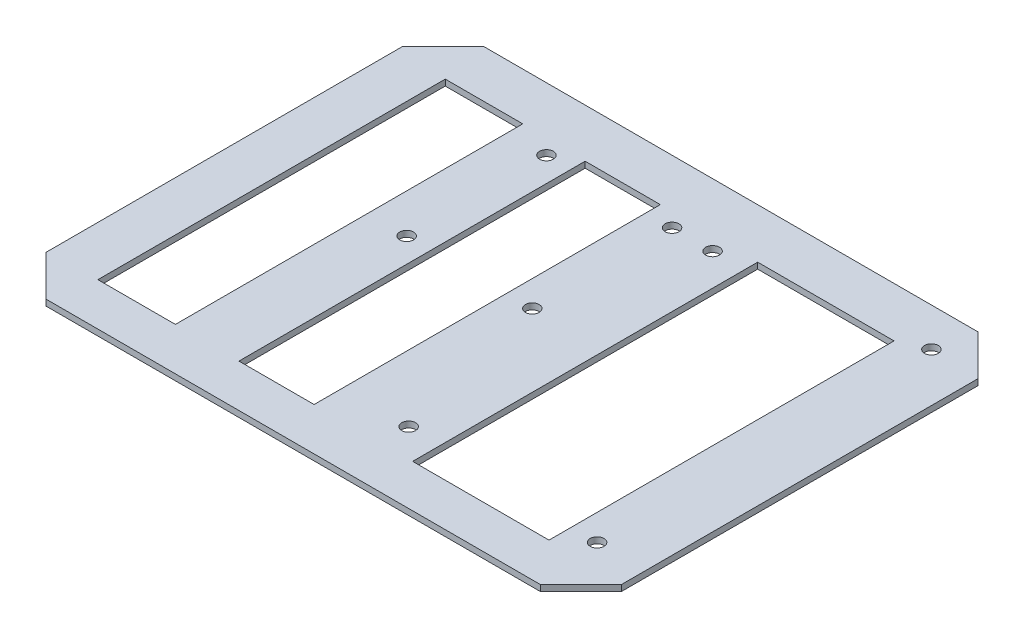
ISO-10303-21;
HEADER;
FILE_DESCRIPTION(('STEP AP214'),'2;1');
FILE_NAME('part.step','',(''),(''),'','','');
FILE_SCHEMA(('AUTOMOTIVE_DESIGN { 1 0 10303 214 1 1 1 1 }'));
ENDSEC;
DATA;
#1=APPLICATION_CONTEXT('core data for automotive mechanical design processes');
#2=APPLICATION_PROTOCOL_DEFINITION('international standard','automotive_design',2000,#1);
#3=PRODUCT_CONTEXT('',#1,'mechanical');
#4=PRODUCT('Part','Part','',(#3));
#5=PRODUCT_RELATED_PRODUCT_CATEGORY('part','',(#4));
#6=PRODUCT_DEFINITION_FORMATION('','',#4);
#7=PRODUCT_DEFINITION_CONTEXT('part definition',#1,'design');
#8=PRODUCT_DEFINITION('design','',#6,#7);
#9=PRODUCT_DEFINITION_SHAPE('','',#8);
#10=(LENGTH_UNIT() NAMED_UNIT(*) SI_UNIT(.MILLI.,.METRE.));
#11=(NAMED_UNIT(*) PLANE_ANGLE_UNIT() SI_UNIT($,.RADIAN.));
#12=(NAMED_UNIT(*) SI_UNIT($,.STERADIAN.) SOLID_ANGLE_UNIT());
#13=UNCERTAINTY_MEASURE_WITH_UNIT(LENGTH_MEASURE(1.E-05),#10,'distance_accuracy_value','');
#14=(GEOMETRIC_REPRESENTATION_CONTEXT(3) GLOBAL_UNCERTAINTY_ASSIGNED_CONTEXT((#13)) GLOBAL_UNIT_ASSIGNED_CONTEXT((#10,
#11,#12)) REPRESENTATION_CONTEXT('',''));
#15=CARTESIAN_POINT('',(0.,0.,0.));
#16=DIRECTION('',(0.,0.,1.));
#17=DIRECTION('',(1.,0.,0.));
#18=AXIS2_PLACEMENT_3D('',#15,#16,#17);
#19=CARTESIAN_POINT('',(71.,1.5,54.));
#20=DIRECTION('',(-1.,0.,0.));
#21=DIRECTION('',(0.,0.,1.));
#22=AXIS2_PLACEMENT_3D('',#19,#20,#21);
#23=PLANE('',#22);
#24=DIRECTION('',(0.,0.,-1.));
#25=VECTOR('',#24,1.);
#26=CARTESIAN_POINT('',(71.,0.,54.));
#27=LINE('',#26,#25);
#28=CARTESIAN_POINT('',(71.,0.,44.));
#29=VERTEX_POINT('',#28);
#30=CARTESIAN_POINT('',(71.,0.,-44.));
#31=VERTEX_POINT('',#30);
#32=EDGE_CURVE('E316',#29,#31,#27,.T.);
#33=ORIENTED_EDGE('',*,*,#32,.T.);
#34=DIRECTION('',(0.,1.,0.));
#35=VECTOR('',#34,1.);
#36=CARTESIAN_POINT('',(71.,1.5,-44.));
#37=LINE('',#36,#35);
#38=CARTESIAN_POINT('',(71.,1.5,-43.9999999999999));
#39=VERTEX_POINT('',#38);
#40=EDGE_CURVE('E358',#31,#39,#37,.T.);
#41=ORIENTED_EDGE('',*,*,#40,.T.);
#42=DIRECTION('',(0.,0.,-1.));
#43=VECTOR('',#42,1.);
#44=CARTESIAN_POINT('',(71.,1.5,54.));
#45=LINE('',#44,#43);
#46=CARTESIAN_POINT('',(71.,1.5,44.));
#47=VERTEX_POINT('',#46);
#48=EDGE_CURVE('E319',#47,#39,#45,.T.);
#49=ORIENTED_EDGE('',*,*,#48,.F.);
#50=DIRECTION('',(0.,-1.,0.));
#51=VECTOR('',#50,1.);
#52=CARTESIAN_POINT('',(71.,1.5,44.));
#53=LINE('',#52,#51);
#54=EDGE_CURVE('E355',#47,#29,#53,.T.);
#55=ORIENTED_EDGE('',*,*,#54,.T.);
#56=EDGE_LOOP('',(#33,#41,#49,#55));
#57=FACE_BOUND('',#56,.T.);
#58=ADVANCED_FACE('F35',(#57),#23,.F.);
#59=CARTESIAN_POINT('',(-71.,1.5,-54.));
#60=DIRECTION('',(0.,0.,1.));
#61=DIRECTION('',(1.,0.,0.));
#62=AXIS2_PLACEMENT_3D('',#59,#60,#61);
#63=PLANE('',#62);
#64=DIRECTION('',(-1.,0.,0.));
#65=VECTOR('',#64,1.);
#66=CARTESIAN_POINT('',(-71.,1.5,-54.));
#67=LINE('',#66,#65);
#68=CARTESIAN_POINT('',(61.,1.5,-54.));
#69=VERTEX_POINT('',#68);
#70=CARTESIAN_POINT('',(-61.,1.5,-54.));
#71=VERTEX_POINT('',#70);
#72=EDGE_CURVE('E322',#69,#71,#67,.T.);
#73=ORIENTED_EDGE('',*,*,#72,.F.);
#74=DIRECTION('',(0.,-1.,0.));
#75=VECTOR('',#74,1.);
#76=CARTESIAN_POINT('',(61.,1.5,-54.));
#77=LINE('',#76,#75);
#78=CARTESIAN_POINT('',(61.,0.,-54.));
#79=VERTEX_POINT('',#78);
#80=EDGE_CURVE('E344',#69,#79,#77,.T.);
#81=ORIENTED_EDGE('',*,*,#80,.T.);
#82=DIRECTION('',(-1.,0.,0.));
#83=VECTOR('',#82,1.);
#84=CARTESIAN_POINT('',(-71.,0.,-54.));
#85=LINE('',#84,#83);
#86=CARTESIAN_POINT('',(-61.,0.,-54.));
#87=VERTEX_POINT('',#86);
#88=EDGE_CURVE('E335',#79,#87,#85,.T.);
#89=ORIENTED_EDGE('',*,*,#88,.T.);
#90=DIRECTION('',(0.,1.,0.));
#91=VECTOR('',#90,1.);
#92=CARTESIAN_POINT('',(-61.,1.5,-54.));
#93=LINE('',#92,#91);
#94=EDGE_CURVE('E332',#87,#71,#93,.T.);
#95=ORIENTED_EDGE('',*,*,#94,.T.);
#96=EDGE_LOOP('',(#73,#81,#89,#95));
#97=FACE_BOUND('',#96,.T.);
#98=ADVANCED_FACE('F396',(#97),#63,.F.);
#99=CARTESIAN_POINT('',(-71.,1.5,54.));
#100=DIRECTION('',(1.,0.,0.));
#101=DIRECTION('',(0.,0.,-1.));
#102=AXIS2_PLACEMENT_3D('',#99,#100,#101);
#103=PLANE('',#102);
#104=DIRECTION('',(0.,0.,1.));
#105=VECTOR('',#104,1.);
#106=CARTESIAN_POINT('',(-71.,1.5,54.));
#107=LINE('',#106,#105);
#108=CARTESIAN_POINT('',(-71.,1.5,-44.));
#109=VERTEX_POINT('',#108);
#110=CARTESIAN_POINT('',(-71.,1.5,44.));
#111=VERTEX_POINT('',#110);
#112=EDGE_CURVE('E326',#109,#111,#107,.T.);
#113=ORIENTED_EDGE('',*,*,#112,.F.);
#114=DIRECTION('',(0.,-1.,0.));
#115=VECTOR('',#114,1.);
#116=CARTESIAN_POINT('',(-71.,1.5,-44.));
#117=LINE('',#116,#115);
#118=CARTESIAN_POINT('',(-71.,0.,-44.));
#119=VERTEX_POINT('',#118);
#120=EDGE_CURVE('E370',#109,#119,#117,.T.);
#121=ORIENTED_EDGE('',*,*,#120,.T.);
#122=DIRECTION('',(0.,0.,1.));
#123=VECTOR('',#122,1.);
#124=CARTESIAN_POINT('',(-71.,0.,54.));
#125=LINE('',#124,#123);
#126=CARTESIAN_POINT('',(-71.,0.,44.));
#127=VERTEX_POINT('',#126);
#128=EDGE_CURVE('E338',#119,#127,#125,.T.);
#129=ORIENTED_EDGE('',*,*,#128,.T.);
#130=DIRECTION('',(0.,1.,0.));
#131=VECTOR('',#130,1.);
#132=CARTESIAN_POINT('',(-71.,1.5,44.));
#133=LINE('',#132,#131);
#134=EDGE_CURVE('E368',#127,#111,#133,.T.);
#135=ORIENTED_EDGE('',*,*,#134,.T.);
#136=EDGE_LOOP('',(#113,#121,#129,#135));
#137=FACE_BOUND('',#136,.T.);
#138=ADVANCED_FACE('F405',(#137),#103,.F.);
#139=CARTESIAN_POINT('',(-71.,1.5,54.));
#140=DIRECTION('',(0.,0.,-1.));
#141=DIRECTION('',(-1.,0.,0.));
#142=AXIS2_PLACEMENT_3D('',#139,#140,#141);
#143=PLANE('',#142);
#144=DIRECTION('',(1.,0.,0.));
#145=VECTOR('',#144,1.);
#146=CARTESIAN_POINT('',(-71.,1.5,54.));
#147=LINE('',#146,#145);
#148=CARTESIAN_POINT('',(-61.,1.5,54.));
#149=VERTEX_POINT('',#148);
#150=CARTESIAN_POINT('',(61.,1.5,54.));
#151=VERTEX_POINT('',#150);
#152=EDGE_CURVE('E329',#149,#151,#147,.T.);
#153=ORIENTED_EDGE('',*,*,#152,.F.);
#154=DIRECTION('',(0.,-1.,0.));
#155=VECTOR('',#154,1.);
#156=CARTESIAN_POINT('',(-61.,1.5,54.));
#157=LINE('',#156,#155);
#158=CARTESIAN_POINT('',(-61.,0.,54.));
#159=VERTEX_POINT('',#158);
#160=EDGE_CURVE('E11',#149,#159,#157,.T.);
#161=ORIENTED_EDGE('',*,*,#160,.T.);
#162=DIRECTION('',(1.,0.,0.));
#163=VECTOR('',#162,1.);
#164=CARTESIAN_POINT('',(-71.,0.,54.));
#165=LINE('',#164,#163);
#166=CARTESIAN_POINT('',(61.,0.,54.));
#167=VERTEX_POINT('',#166);
#168=EDGE_CURVE('E323',#159,#167,#165,.T.);
#169=ORIENTED_EDGE('',*,*,#168,.T.);
#170=DIRECTION('',(0.,1.,0.));
#171=VECTOR('',#170,1.);
#172=CARTESIAN_POINT('',(61.,1.5,54.));
#173=LINE('',#172,#171);
#174=EDGE_CURVE('E43',#167,#151,#173,.T.);
#175=ORIENTED_EDGE('',*,*,#174,.T.);
#176=EDGE_LOOP('',(#153,#161,#169,#175));
#177=FACE_BOUND('',#176,.T.);
#178=ADVANCED_FACE('F375',(#177),#143,.F.);
#179=CARTESIAN_POINT('',(0.,1.5,0.));
#180=DIRECTION('',(0.,-1.,0.));
#181=DIRECTION('',(0.,0.,-1.));
#182=AXIS2_PLACEMENT_3D('',#179,#180,#181);
#183=PLANE('',#182);
#184=DIRECTION('',(1.,0.,0.));
#185=VECTOR('',#184,1.);
#186=CARTESIAN_POINT('',(-23.9488066003176,1.5,43.4386762360115));
#187=LINE('',#186,#185);
#188=CARTESIAN_POINT('',(-23.9488066003176,1.5,43.4386762360115));
#189=VERTEX_POINT('',#188);
#190=CARTESIAN_POINT('',(-5.39387536043187,1.5,43.4386762360115));
#191=VERTEX_POINT('',#190);
#192=EDGE_CURVE('E191',#189,#191,#187,.T.);
#193=ORIENTED_EDGE('',*,*,#192,.F.);
#194=DIRECTION('',(0.,0.,1.));
#195=VECTOR('',#194,1.);
#196=CARTESIAN_POINT('',(-23.9488066003176,1.5,-42.0003094732297));
#197=LINE('',#196,#195);
#198=CARTESIAN_POINT('',(-23.9488066003176,1.5,-42.0003094732297));
#199=VERTEX_POINT('',#198);
#200=EDGE_CURVE('E50',#199,#189,#197,.T.);
#201=ORIENTED_EDGE('',*,*,#200,.F.);
#202=DIRECTION('',(-1.,0.,0.));
#203=VECTOR('',#202,1.);
#204=CARTESIAN_POINT('',(-23.9488066003176,1.5,-42.0003094732297));
#205=LINE('',#204,#203);
#206=CARTESIAN_POINT('',(-5.39387536043187,1.5,-42.0003094732297));
#207=VERTEX_POINT('',#206);
#208=EDGE_CURVE('E184',#207,#199,#205,.T.);
#209=ORIENTED_EDGE('',*,*,#208,.F.);
#210=DIRECTION('',(0.,0.,-1.));
#211=VECTOR('',#210,1.);
#212=CARTESIAN_POINT('',(-5.39387536043187,1.5,-42.0003094732297));
#213=LINE('',#212,#211);
#214=EDGE_CURVE('E198',#191,#207,#213,.T.);
#215=ORIENTED_EDGE('',*,*,#214,.F.);
#216=EDGE_LOOP('',(#193,#201,#209,#215));
#217=FACE_BOUND('',#216,.T.);
#218=DIRECTION('',(1.,0.,0.));
#219=VECTOR('',#218,1.);
#220=CARTESIAN_POINT('',(18.9145229305812,1.5,43.4386762360115));
#221=LINE('',#220,#219);
#222=CARTESIAN_POINT('',(18.9145229305812,1.5,43.4386762360115));
#223=VERTEX_POINT('',#222);
#224=CARTESIAN_POINT('',(52.5723051796762,1.5,43.4386762360115));
#225=VERTEX_POINT('',#224);
#226=EDGE_CURVE('E217',#223,#225,#221,.T.);
#227=ORIENTED_EDGE('',*,*,#226,.F.);
#228=DIRECTION('',(0.,0.,1.));
#229=VECTOR('',#228,1.);
#230=CARTESIAN_POINT('',(18.9145229305812,1.5,-41.7126361206733));
#231=LINE('',#230,#229);
#232=CARTESIAN_POINT('',(18.9145229305812,1.5,-41.7126361206733));
#233=VERTEX_POINT('',#232);
#234=EDGE_CURVE('E215',#233,#223,#231,.T.);
#235=ORIENTED_EDGE('',*,*,#234,.F.);
#236=DIRECTION('',(-1.,0.,0.));
#237=VECTOR('',#236,1.);
#238=CARTESIAN_POINT('',(18.9145229305812,1.5,-41.7126361206733));
#239=LINE('',#238,#237);
#240=CARTESIAN_POINT('',(52.5723051796762,1.5,-41.7126361206733));
#241=VERTEX_POINT('',#240);
#242=EDGE_CURVE('E223',#241,#233,#239,.T.);
#243=ORIENTED_EDGE('',*,*,#242,.F.);
#244=DIRECTION('',(0.,0.,-1.));
#245=VECTOR('',#244,1.);
#246=CARTESIAN_POINT('',(52.5723051796762,1.5,-41.7126361206733));
#247=LINE('',#246,#245);
#248=EDGE_CURVE('E220',#225,#241,#247,.T.);
#249=ORIENTED_EDGE('',*,*,#248,.F.);
#250=EDGE_LOOP('',(#227,#235,#243,#249));
#251=FACE_BOUND('',#250,.T.);
#252=DIRECTION('',(1.,0.,0.));
#253=VECTOR('',#252,1.);
#254=CARTESIAN_POINT('',(-58.7572822596381,1.5,43.4386762360115));
#255=LINE('',#254,#253);
#256=CARTESIAN_POINT('',(-58.7572822596381,1.5,43.4386762360115));
#257=VERTEX_POINT('',#256);
#258=CARTESIAN_POINT('',(-39.6270043146396,1.5,43.4386762360115));
#259=VERTEX_POINT('',#258);
#260=EDGE_CURVE('E249',#257,#259,#255,.T.);
#261=ORIENTED_EDGE('',*,*,#260,.F.);
#262=DIRECTION('',(0.,0.,1.));
#263=VECTOR('',#262,1.);
#264=CARTESIAN_POINT('',(-58.7572822596381,1.5,-42.287982825786));
#265=LINE('',#264,#263);
#266=CARTESIAN_POINT('',(-58.7572822596381,1.5,-42.287982825786));
#267=VERTEX_POINT('',#266);
#268=EDGE_CURVE('E247',#267,#257,#265,.T.);
#269=ORIENTED_EDGE('',*,*,#268,.F.);
#270=DIRECTION('',(-1.,0.,0.));
#271=VECTOR('',#270,1.);
#272=CARTESIAN_POINT('',(-58.7572822596381,1.5,-42.287982825786));
#273=LINE('',#272,#271);
#274=CARTESIAN_POINT('',(-39.6270043146396,1.5,-42.287982825786));
#275=VERTEX_POINT('',#274);
#276=EDGE_CURVE('E255',#275,#267,#273,.T.);
#277=ORIENTED_EDGE('',*,*,#276,.F.);
#278=DIRECTION('',(0.,0.,-1.));
#279=VECTOR('',#278,1.);
#280=CARTESIAN_POINT('',(-39.6270043146396,1.5,-42.287982825786));
#281=LINE('',#280,#279);
#282=EDGE_CURVE('E252',#259,#275,#281,.T.);
#283=ORIENTED_EDGE('',*,*,#282,.F.);
#284=EDGE_LOOP('',(#261,#269,#277,#283));
#285=FACE_BOUND('',#284,.T.);
#286=CARTESIAN_POINT('',(-30.,1.5,-4.));
#287=DIRECTION('',(0.,1.,0.));
#288=DIRECTION('',(0.,0.,1.));
#289=AXIS2_PLACEMENT_3D('',#286,#287,#288);
#290=CIRCLE('',#289,1.7);
#291=CARTESIAN_POINT('',(-30.,1.5,-2.3));
#292=VERTEX_POINT('',#291);
#293=EDGE_CURVE('E271',#292,#292,#290,.T.);
#294=ORIENTED_EDGE('',*,*,#293,.F.);
#295=EDGE_LOOP('',(#294));
#296=FACE_BOUND('',#295,.T.);
#297=CARTESIAN_POINT('',(0.999999999999982,1.5,-4.));
#298=DIRECTION('',(0.,1.,0.));
#299=DIRECTION('',(0.,0.,1.));
#300=AXIS2_PLACEMENT_3D('',#297,#298,#299);
#301=CIRCLE('',#300,1.7);
#302=CARTESIAN_POINT('',(0.999999999999982,1.5,-2.3));
#303=VERTEX_POINT('',#302);
#304=EDGE_CURVE('E277',#303,#303,#301,.T.);
#305=ORIENTED_EDGE('',*,*,#304,.F.);
#306=EDGE_LOOP('',(#305));
#307=FACE_BOUND('',#306,.T.);
#308=CARTESIAN_POINT('',(0.999999999999977,1.5,-38.5));
#309=DIRECTION('',(0.,1.,0.));
#310=DIRECTION('',(0.,0.,1.));
#311=AXIS2_PLACEMENT_3D('',#308,#309,#310);
#312=CIRCLE('',#311,1.7);
#313=CARTESIAN_POINT('',(0.999999999999977,1.5,-36.8));
#314=VERTEX_POINT('',#313);
#315=EDGE_CURVE('E283',#314,#314,#312,.T.);
#316=ORIENTED_EDGE('',*,*,#315,.F.);
#317=EDGE_LOOP('',(#316));
#318=FACE_BOUND('',#317,.T.);
#319=CARTESIAN_POINT('',(-30.,1.5,-38.5));
#320=DIRECTION('',(0.,1.,0.));
#321=DIRECTION('',(0.,0.,1.));
#322=AXIS2_PLACEMENT_3D('',#319,#320,#321);
#323=CIRCLE('',#322,1.7);
#324=CARTESIAN_POINT('',(-30.,1.5,-36.8));
#325=VERTEX_POINT('',#324);
#326=EDGE_CURVE('E289',#325,#325,#323,.T.);
#327=ORIENTED_EDGE('',*,*,#326,.F.);
#328=EDGE_LOOP('',(#327));
#329=FACE_BOUND('',#328,.T.);
#330=CARTESIAN_POINT('',(59.,1.5,38.));
#331=DIRECTION('',(0.,1.,0.));
#332=DIRECTION('',(0.,0.,1.));
#333=AXIS2_PLACEMENT_3D('',#330,#331,#332);
#334=CIRCLE('',#333,1.7);
#335=CARTESIAN_POINT('',(59.,1.5,39.7));
#336=VERTEX_POINT('',#335);
#337=EDGE_CURVE('E295',#336,#336,#334,.T.);
#338=ORIENTED_EDGE('',*,*,#337,.F.);
#339=EDGE_LOOP('',(#338));
#340=FACE_BOUND('',#339,.T.);
#341=CARTESIAN_POINT('',(11.,1.5,36.5));
#342=DIRECTION('',(0.,1.,0.));
#343=DIRECTION('',(0.,0.,1.));
#344=AXIS2_PLACEMENT_3D('',#341,#342,#343);
#345=CIRCLE('',#344,1.7);
#346=CARTESIAN_POINT('',(11.,1.5,38.2));
#347=VERTEX_POINT('',#346);
#348=EDGE_CURVE('E301',#347,#347,#345,.T.);
#349=ORIENTED_EDGE('',*,*,#348,.F.);
#350=EDGE_LOOP('',(#349));
#351=FACE_BOUND('',#350,.T.);
#352=CARTESIAN_POINT('',(11.,1.5,-38.5));
#353=DIRECTION('',(0.,1.,0.));
#354=DIRECTION('',(0.,0.,1.));
#355=AXIS2_PLACEMENT_3D('',#352,#353,#354);
#356=CIRCLE('',#355,1.7);
#357=CARTESIAN_POINT('',(11.,1.5,-36.8));
#358=VERTEX_POINT('',#357);
#359=EDGE_CURVE('E307',#358,#358,#356,.T.);
#360=ORIENTED_EDGE('',*,*,#359,.F.);
#361=EDGE_LOOP('',(#360));
#362=FACE_BOUND('',#361,.T.);
#363=CARTESIAN_POINT('',(59.,1.5,-44.5));
#364=DIRECTION('',(0.,1.,0.));
#365=DIRECTION('',(0.,0.,1.));
#366=AXIS2_PLACEMENT_3D('',#363,#364,#365);
#367=CIRCLE('',#366,1.7);
#368=CARTESIAN_POINT('',(59.,1.5,-42.8));
#369=VERTEX_POINT('',#368);
#370=EDGE_CURVE('E313',#369,#369,#367,.T.);
#371=ORIENTED_EDGE('',*,*,#370,.F.);
#372=EDGE_LOOP('',(#371));
#373=FACE_BOUND('',#372,.T.);
#374=ORIENTED_EDGE('',*,*,#48,.T.);
#375=DIRECTION('',(0.707106781186545,0.,0.70710678118655));
#376=VECTOR('',#375,1.);
#377=CARTESIAN_POINT('',(61.,1.5,-54.));
#378=LINE('',#377,#376);
#379=EDGE_CURVE('E366',#39,#69,#378,.F.);
#380=ORIENTED_EDGE('',*,*,#379,.T.);
#381=ORIENTED_EDGE('',*,*,#72,.T.);
#382=DIRECTION('',(0.707106781186548,0.,-0.707106781186547));
#383=VECTOR('',#382,1.);
#384=CARTESIAN_POINT('',(-71.,1.5,-44.));
#385=LINE('',#384,#383);
#386=EDGE_CURVE('E364',#71,#109,#385,.F.);
#387=ORIENTED_EDGE('',*,*,#386,.T.);
#388=ORIENTED_EDGE('',*,*,#112,.T.);
#389=DIRECTION('',(-0.707106781186546,0.,-0.70710678118655));
#390=VECTOR('',#389,1.);
#391=CARTESIAN_POINT('',(-61.,1.5,54.));
#392=LINE('',#391,#390);
#393=EDGE_CURVE('E362',#111,#149,#392,.F.);
#394=ORIENTED_EDGE('',*,*,#393,.T.);
#395=ORIENTED_EDGE('',*,*,#152,.T.);
#396=DIRECTION('',(-0.707106781186549,0.,0.707106781186547));
#397=VECTOR('',#396,1.);
#398=CARTESIAN_POINT('',(71.,1.5,44.));
#399=LINE('',#398,#397);
#400=EDGE_CURVE('E360',#151,#47,#399,.F.);
#401=ORIENTED_EDGE('',*,*,#400,.T.);
#402=EDGE_LOOP('',(#374,#380,#381,#387,#388,#394,#395,#401));
#403=FACE_BOUND('',#402,.T.);
#404=ADVANCED_FACE('F381',(#217,#251,#285,#296,#307,#318,#329,#340,#351,#362,#373,#403),#183,.F.);
#405=CARTESIAN_POINT('',(0.,0.,0.));
#406=DIRECTION('',(0.,-1.,0.));
#407=DIRECTION('',(0.,0.,-1.));
#408=AXIS2_PLACEMENT_3D('',#405,#406,#407);
#409=PLANE('',#408);
#410=DIRECTION('',(0.,0.,1.));
#411=VECTOR('',#410,1.);
#412=CARTESIAN_POINT('',(-23.9488066003176,0.,-42.0003094732297));
#413=LINE('',#412,#411);
#414=CARTESIAN_POINT('',(-23.9488066003176,0.,-42.0003094732297));
#415=VERTEX_POINT('',#414);
#416=CARTESIAN_POINT('',(-23.9488066003176,0.,43.4386762360115));
#417=VERTEX_POINT('',#416);
#418=EDGE_CURVE('E182',#415,#417,#413,.T.);
#419=ORIENTED_EDGE('',*,*,#418,.T.);
#420=DIRECTION('',(1.,0.,0.));
#421=VECTOR('',#420,1.);
#422=CARTESIAN_POINT('',(-23.9488066003176,0.,43.4386762360115));
#423=LINE('',#422,#421);
#424=CARTESIAN_POINT('',(-5.39387536043187,0.,43.4386762360115));
#425=VERTEX_POINT('',#424);
#426=EDGE_CURVE('E171',#417,#425,#423,.T.);
#427=ORIENTED_EDGE('',*,*,#426,.T.);
#428=DIRECTION('',(0.,0.,-1.));
#429=VECTOR('',#428,1.);
#430=CARTESIAN_POINT('',(-5.39387536043187,0.,-42.0003094732297));
#431=LINE('',#430,#429);
#432=CARTESIAN_POINT('',(-5.39387536043187,0.,-42.0003094732297));
#433=VERTEX_POINT('',#432);
#434=EDGE_CURVE('E193',#425,#433,#431,.T.);
#435=ORIENTED_EDGE('',*,*,#434,.T.);
#436=DIRECTION('',(-1.,0.,0.));
#437=VECTOR('',#436,1.);
#438=CARTESIAN_POINT('',(-23.9488066003176,0.,-42.0003094732297));
#439=LINE('',#438,#437);
#440=EDGE_CURVE('E189',#433,#415,#439,.T.);
#441=ORIENTED_EDGE('',*,*,#440,.T.);
#442=EDGE_LOOP('',(#419,#427,#435,#441));
#443=FACE_BOUND('',#442,.T.);
#444=DIRECTION('',(0.,0.,1.));
#445=VECTOR('',#444,1.);
#446=CARTESIAN_POINT('',(18.9145229305812,0.,-41.7126361206733));
#447=LINE('',#446,#445);
#448=CARTESIAN_POINT('',(18.9145229305812,0.,-41.7126361206733));
#449=VERTEX_POINT('',#448);
#450=CARTESIAN_POINT('',(18.9145229305812,0.,43.4386762360115));
#451=VERTEX_POINT('',#450);
#452=EDGE_CURVE('E212',#449,#451,#447,.T.);
#453=ORIENTED_EDGE('',*,*,#452,.T.);
#454=DIRECTION('',(1.,0.,0.));
#455=VECTOR('',#454,1.);
#456=CARTESIAN_POINT('',(18.9145229305812,0.,43.4386762360115));
#457=LINE('',#456,#455);
#458=CARTESIAN_POINT('',(52.5723051796762,0.,43.4386762360115));
#459=VERTEX_POINT('',#458);
#460=EDGE_CURVE('E229',#451,#459,#457,.T.);
#461=ORIENTED_EDGE('',*,*,#460,.T.);
#462=DIRECTION('',(0.,0.,-1.));
#463=VECTOR('',#462,1.);
#464=CARTESIAN_POINT('',(52.5723051796762,0.,-41.7126361206733));
#465=LINE('',#464,#463);
#466=CARTESIAN_POINT('',(52.5723051796762,0.,-41.7126361206733));
#467=VERTEX_POINT('',#466);
#468=EDGE_CURVE('E178',#459,#467,#465,.T.);
#469=ORIENTED_EDGE('',*,*,#468,.T.);
#470=DIRECTION('',(-1.,0.,0.));
#471=VECTOR('',#470,1.);
#472=CARTESIAN_POINT('',(18.9145229305812,0.,-41.7126361206733));
#473=LINE('',#472,#471);
#474=EDGE_CURVE('E209',#467,#449,#473,.T.);
#475=ORIENTED_EDGE('',*,*,#474,.T.);
#476=EDGE_LOOP('',(#453,#461,#469,#475));
#477=FACE_BOUND('',#476,.T.);
#478=DIRECTION('',(0.,0.,1.));
#479=VECTOR('',#478,1.);
#480=CARTESIAN_POINT('',(-58.7572822596381,0.,-42.287982825786));
#481=LINE('',#480,#479);
#482=CARTESIAN_POINT('',(-58.7572822596381,0.,-42.287982825786));
#483=VERTEX_POINT('',#482);
#484=CARTESIAN_POINT('',(-58.7572822596381,0.,43.4386762360115));
#485=VERTEX_POINT('',#484);
#486=EDGE_CURVE('E244',#483,#485,#481,.T.);
#487=ORIENTED_EDGE('',*,*,#486,.T.);
#488=DIRECTION('',(1.,0.,0.));
#489=VECTOR('',#488,1.);
#490=CARTESIAN_POINT('',(-58.7572822596381,0.,43.4386762360115));
#491=LINE('',#490,#489);
#492=CARTESIAN_POINT('',(-39.6270043146396,0.,43.4386762360115));
#493=VERTEX_POINT('',#492);
#494=EDGE_CURVE('E261',#485,#493,#491,.T.);
#495=ORIENTED_EDGE('',*,*,#494,.T.);
#496=DIRECTION('',(0.,0.,-1.));
#497=VECTOR('',#496,1.);
#498=CARTESIAN_POINT('',(-39.6270043146396,0.,-42.287982825786));
#499=LINE('',#498,#497);
#500=CARTESIAN_POINT('',(-39.6270043146396,0.,-42.287982825786));
#501=VERTEX_POINT('',#500);
#502=EDGE_CURVE('E238',#493,#501,#499,.T.);
#503=ORIENTED_EDGE('',*,*,#502,.T.);
#504=DIRECTION('',(-1.,0.,0.));
#505=VECTOR('',#504,1.);
#506=CARTESIAN_POINT('',(-58.7572822596381,0.,-42.287982825786));
#507=LINE('',#506,#505);
#508=EDGE_CURVE('E241',#501,#483,#507,.T.);
#509=ORIENTED_EDGE('',*,*,#508,.T.);
#510=EDGE_LOOP('',(#487,#495,#503,#509));
#511=FACE_BOUND('',#510,.T.);
#512=CARTESIAN_POINT('',(-30.,0.,-4.));
#513=DIRECTION('',(0.,-1.,0.));
#514=DIRECTION('',(0.,0.,-1.));
#515=AXIS2_PLACEMENT_3D('',#512,#513,#514);
#516=CIRCLE('',#515,1.7);
#517=CARTESIAN_POINT('',(-30.,0.,-5.7));
#518=VERTEX_POINT('',#517);
#519=EDGE_CURVE('E270',#518,#518,#516,.F.);
#520=ORIENTED_EDGE('',*,*,#519,.T.);
#521=EDGE_LOOP('',(#520));
#522=FACE_BOUND('',#521,.T.);
#523=CARTESIAN_POINT('',(0.999999999999982,0.,-4.));
#524=DIRECTION('',(0.,-1.,0.));
#525=DIRECTION('',(0.,0.,-1.));
#526=AXIS2_PLACEMENT_3D('',#523,#524,#525);
#527=CIRCLE('',#526,1.7);
#528=CARTESIAN_POINT('',(0.999999999999982,0.,-5.7));
#529=VERTEX_POINT('',#528);
#530=EDGE_CURVE('E274',#529,#529,#527,.F.);
#531=ORIENTED_EDGE('',*,*,#530,.T.);
#532=EDGE_LOOP('',(#531));
#533=FACE_BOUND('',#532,.T.);
#534=CARTESIAN_POINT('',(0.999999999999977,0.,-38.5));
#535=DIRECTION('',(0.,-1.,0.));
#536=DIRECTION('',(0.,0.,-1.));
#537=AXIS2_PLACEMENT_3D('',#534,#535,#536);
#538=CIRCLE('',#537,1.7);
#539=CARTESIAN_POINT('',(0.999999999999977,0.,-40.2));
#540=VERTEX_POINT('',#539);
#541=EDGE_CURVE('E280',#540,#540,#538,.F.);
#542=ORIENTED_EDGE('',*,*,#541,.T.);
#543=EDGE_LOOP('',(#542));
#544=FACE_BOUND('',#543,.T.);
#545=CARTESIAN_POINT('',(-30.,0.,-38.5));
#546=DIRECTION('',(0.,-1.,0.));
#547=DIRECTION('',(0.,0.,-1.));
#548=AXIS2_PLACEMENT_3D('',#545,#546,#547);
#549=CIRCLE('',#548,1.7);
#550=CARTESIAN_POINT('',(-30.,0.,-40.2));
#551=VERTEX_POINT('',#550);
#552=EDGE_CURVE('E286',#551,#551,#549,.F.);
#553=ORIENTED_EDGE('',*,*,#552,.T.);
#554=EDGE_LOOP('',(#553));
#555=FACE_BOUND('',#554,.T.);
#556=CARTESIAN_POINT('',(59.,0.,38.));
#557=DIRECTION('',(0.,-1.,0.));
#558=DIRECTION('',(0.,0.,-1.));
#559=AXIS2_PLACEMENT_3D('',#556,#557,#558);
#560=CIRCLE('',#559,1.7);
#561=CARTESIAN_POINT('',(59.,0.,36.3));
#562=VERTEX_POINT('',#561);
#563=EDGE_CURVE('E292',#562,#562,#560,.F.);
#564=ORIENTED_EDGE('',*,*,#563,.T.);
#565=EDGE_LOOP('',(#564));
#566=FACE_BOUND('',#565,.T.);
#567=CARTESIAN_POINT('',(11.,0.,36.5));
#568=DIRECTION('',(0.,-1.,0.));
#569=DIRECTION('',(0.,0.,-1.));
#570=AXIS2_PLACEMENT_3D('',#567,#568,#569);
#571=CIRCLE('',#570,1.7);
#572=CARTESIAN_POINT('',(11.,0.,34.8));
#573=VERTEX_POINT('',#572);
#574=EDGE_CURVE('E298',#573,#573,#571,.F.);
#575=ORIENTED_EDGE('',*,*,#574,.T.);
#576=EDGE_LOOP('',(#575));
#577=FACE_BOUND('',#576,.T.);
#578=CARTESIAN_POINT('',(11.,0.,-38.5));
#579=DIRECTION('',(0.,-1.,0.));
#580=DIRECTION('',(0.,0.,-1.));
#581=AXIS2_PLACEMENT_3D('',#578,#579,#580);
#582=CIRCLE('',#581,1.7);
#583=CARTESIAN_POINT('',(11.,0.,-40.2));
#584=VERTEX_POINT('',#583);
#585=EDGE_CURVE('E304',#584,#584,#582,.F.);
#586=ORIENTED_EDGE('',*,*,#585,.T.);
#587=EDGE_LOOP('',(#586));
#588=FACE_BOUND('',#587,.T.);
#589=CARTESIAN_POINT('',(59.,0.,-44.5));
#590=DIRECTION('',(0.,-1.,0.));
#591=DIRECTION('',(0.,0.,-1.));
#592=AXIS2_PLACEMENT_3D('',#589,#590,#591);
#593=CIRCLE('',#592,1.7);
#594=CARTESIAN_POINT('',(59.,0.,-46.2));
#595=VERTEX_POINT('',#594);
#596=EDGE_CURVE('E310',#595,#595,#593,.F.);
#597=ORIENTED_EDGE('',*,*,#596,.T.);
#598=EDGE_LOOP('',(#597));
#599=FACE_BOUND('',#598,.T.);
#600=ORIENTED_EDGE('',*,*,#88,.F.);
#601=DIRECTION('',(-0.707106781186545,0.,-0.70710678118655));
#602=VECTOR('',#601,1.);
#603=CARTESIAN_POINT('',(57.5000000000002,0.,-57.4999999999998));
#604=LINE('',#603,#602);
#605=EDGE_CURVE('E353',#79,#31,#604,.F.);
#606=ORIENTED_EDGE('',*,*,#605,.T.);
#607=ORIENTED_EDGE('',*,*,#32,.F.);
#608=DIRECTION('',(0.707106781186549,0.,-0.707106781186547));
#609=VECTOR('',#608,1.);
#610=CARTESIAN_POINT('',(57.4999999999999,0.,57.5000000000001));
#611=LINE('',#610,#609);
#612=EDGE_CURVE('E347',#29,#167,#611,.F.);
#613=ORIENTED_EDGE('',*,*,#612,.T.);
#614=ORIENTED_EDGE('',*,*,#168,.F.);
#615=DIRECTION('',(0.707106781186546,0.,0.70710678118655));
#616=VECTOR('',#615,1.);
#617=CARTESIAN_POINT('',(-57.5000000000002,0.,57.4999999999999));
#618=LINE('',#617,#616);
#619=EDGE_CURVE('E349',#159,#127,#618,.F.);
#620=ORIENTED_EDGE('',*,*,#619,.T.);
#621=ORIENTED_EDGE('',*,*,#128,.F.);
#622=DIRECTION('',(-0.707106781186548,0.,0.707106781186547));
#623=VECTOR('',#622,1.);
#624=CARTESIAN_POINT('',(-57.4999999999999,0.,-57.5));
#625=LINE('',#624,#623);
#626=EDGE_CURVE('E351',#119,#87,#625,.F.);
#627=ORIENTED_EDGE('',*,*,#626,.T.);
#628=EDGE_LOOP('',(#600,#606,#607,#613,#614,#620,#621,#627));
#629=FACE_BOUND('',#628,.T.);
#630=ADVANCED_FACE('F187',(#443,#477,#511,#522,#533,#544,#555,#566,#577,#588,#599,#629),#409,.T.);
#631=CARTESIAN_POINT('',(61.,1.5,-54.));
#632=DIRECTION('',(-0.70710678118655,0.,0.707106781186545));
#633=DIRECTION('',(0.,-1.,0.));
#634=AXIS2_PLACEMENT_3D('',#631,#632,#633);
#635=PLANE('',#634);
#636=ORIENTED_EDGE('',*,*,#379,.F.);
#637=ORIENTED_EDGE('',*,*,#40,.F.);
#638=ORIENTED_EDGE('',*,*,#605,.F.);
#639=ORIENTED_EDGE('',*,*,#80,.F.);
#640=EDGE_LOOP('',(#636,#637,#638,#639));
#641=FACE_BOUND('',#640,.T.);
#642=ADVANCED_FACE('F393',(#641),#635,.F.);
#643=CARTESIAN_POINT('',(-71.,1.5,-44.));
#644=DIRECTION('',(0.707106781186547,0.,0.707106781186548));
#645=DIRECTION('',(0.,-1.,0.));
#646=AXIS2_PLACEMENT_3D('',#643,#644,#645);
#647=PLANE('',#646);
#648=ORIENTED_EDGE('',*,*,#386,.F.);
#649=ORIENTED_EDGE('',*,*,#94,.F.);
#650=ORIENTED_EDGE('',*,*,#626,.F.);
#651=ORIENTED_EDGE('',*,*,#120,.F.);
#652=EDGE_LOOP('',(#648,#649,#650,#651));
#653=FACE_BOUND('',#652,.T.);
#654=ADVANCED_FACE('F402',(#653),#647,.F.);
#655=CARTESIAN_POINT('',(-61.,1.5,54.));
#656=DIRECTION('',(0.707106781186549,0.,-0.707106781186545));
#657=DIRECTION('',(0.,-1.,0.));
#658=AXIS2_PLACEMENT_3D('',#655,#656,#657);
#659=PLANE('',#658);
#660=ORIENTED_EDGE('',*,*,#393,.F.);
#661=ORIENTED_EDGE('',*,*,#134,.F.);
#662=ORIENTED_EDGE('',*,*,#619,.F.);
#663=ORIENTED_EDGE('',*,*,#160,.F.);
#664=EDGE_LOOP('',(#660,#661,#662,#663));
#665=FACE_BOUND('',#664,.T.);
#666=ADVANCED_FACE('F408',(#665),#659,.F.);
#667=CARTESIAN_POINT('',(71.,1.5,44.));
#668=DIRECTION('',(-0.707106781186546,0.,-0.707106781186548));
#669=DIRECTION('',(0.,-1.,0.));
#670=AXIS2_PLACEMENT_3D('',#667,#668,#669);
#671=PLANE('',#670);
#672=ORIENTED_EDGE('',*,*,#400,.F.);
#673=ORIENTED_EDGE('',*,*,#174,.F.);
#674=ORIENTED_EDGE('',*,*,#612,.F.);
#675=ORIENTED_EDGE('',*,*,#54,.F.);
#676=EDGE_LOOP('',(#672,#673,#674,#675));
#677=FACE_BOUND('',#676,.T.);
#678=ADVANCED_FACE('F37',(#677),#671,.F.);
#679=CARTESIAN_POINT('',(59.,-0.000999999999999916,-44.5));
#680=DIRECTION('',(0.,1.,0.));
#681=DIRECTION('',(0.,0.,1.));
#682=AXIS2_PLACEMENT_3D('',#679,#680,#681);
#683=CYLINDRICAL_SURFACE('',#682,1.7);
#684=ORIENTED_EDGE('',*,*,#596,.F.);
#685=EDGE_LOOP('',(#684));
#686=FACE_BOUND('',#685,.T.);
#687=ORIENTED_EDGE('',*,*,#370,.T.);
#688=EDGE_LOOP('',(#687));
#689=FACE_BOUND('',#688,.T.);
#690=ADVANCED_FACE('F414',(#686,#689),#683,.F.);
#691=CARTESIAN_POINT('',(11.,-0.000999999999999916,-38.5));
#692=DIRECTION('',(0.,1.,0.));
#693=DIRECTION('',(0.,0.,1.));
#694=AXIS2_PLACEMENT_3D('',#691,#692,#693);
#695=CYLINDRICAL_SURFACE('',#694,1.7);
#696=ORIENTED_EDGE('',*,*,#585,.F.);
#697=EDGE_LOOP('',(#696));
#698=FACE_BOUND('',#697,.T.);
#699=ORIENTED_EDGE('',*,*,#359,.T.);
#700=EDGE_LOOP('',(#699));
#701=FACE_BOUND('',#700,.T.);
#702=ADVANCED_FACE('F603',(#698,#701),#695,.F.);
#703=CARTESIAN_POINT('',(11.,-0.000999999999999916,36.5));
#704=DIRECTION('',(0.,1.,0.));
#705=DIRECTION('',(0.,0.,1.));
#706=AXIS2_PLACEMENT_3D('',#703,#704,#705);
#707=CYLINDRICAL_SURFACE('',#706,1.7);
#708=ORIENTED_EDGE('',*,*,#574,.F.);
#709=EDGE_LOOP('',(#708));
#710=FACE_BOUND('',#709,.T.);
#711=ORIENTED_EDGE('',*,*,#348,.T.);
#712=EDGE_LOOP('',(#711));
#713=FACE_BOUND('',#712,.T.);
#714=ADVANCED_FACE('F599',(#710,#713),#707,.F.);
#715=CARTESIAN_POINT('',(59.,-0.000999999999999916,38.));
#716=DIRECTION('',(0.,1.,0.));
#717=DIRECTION('',(0.,0.,1.));
#718=AXIS2_PLACEMENT_3D('',#715,#716,#717);
#719=CYLINDRICAL_SURFACE('',#718,1.7);
#720=ORIENTED_EDGE('',*,*,#563,.F.);
#721=EDGE_LOOP('',(#720));
#722=FACE_BOUND('',#721,.T.);
#723=ORIENTED_EDGE('',*,*,#337,.T.);
#724=EDGE_LOOP('',(#723));
#725=FACE_BOUND('',#724,.T.);
#726=ADVANCED_FACE('F595',(#722,#725),#719,.F.);
#727=CARTESIAN_POINT('',(-30.,-0.000999999999999916,-38.5));
#728=DIRECTION('',(0.,1.,0.));
#729=DIRECTION('',(0.,0.,1.));
#730=AXIS2_PLACEMENT_3D('',#727,#728,#729);
#731=CYLINDRICAL_SURFACE('',#730,1.7);
#732=ORIENTED_EDGE('',*,*,#552,.F.);
#733=EDGE_LOOP('',(#732));
#734=FACE_BOUND('',#733,.T.);
#735=ORIENTED_EDGE('',*,*,#326,.T.);
#736=EDGE_LOOP('',(#735));
#737=FACE_BOUND('',#736,.T.);
#738=ADVANCED_FACE('F591',(#734,#737),#731,.F.);
#739=CARTESIAN_POINT('',(0.999999999999977,-0.000999999999999916,-38.5));
#740=DIRECTION('',(0.,1.,0.));
#741=DIRECTION('',(0.,0.,1.));
#742=AXIS2_PLACEMENT_3D('',#739,#740,#741);
#743=CYLINDRICAL_SURFACE('',#742,1.7);
#744=ORIENTED_EDGE('',*,*,#541,.F.);
#745=EDGE_LOOP('',(#744));
#746=FACE_BOUND('',#745,.T.);
#747=ORIENTED_EDGE('',*,*,#315,.T.);
#748=EDGE_LOOP('',(#747));
#749=FACE_BOUND('',#748,.T.);
#750=ADVANCED_FACE('F587',(#746,#749),#743,.F.);
#751=CARTESIAN_POINT('',(0.999999999999982,-0.000999999999999916,-4.));
#752=DIRECTION('',(0.,1.,0.));
#753=DIRECTION('',(0.,0.,1.));
#754=AXIS2_PLACEMENT_3D('',#751,#752,#753);
#755=CYLINDRICAL_SURFACE('',#754,1.7);
#756=ORIENTED_EDGE('',*,*,#530,.F.);
#757=EDGE_LOOP('',(#756));
#758=FACE_BOUND('',#757,.T.);
#759=ORIENTED_EDGE('',*,*,#304,.T.);
#760=EDGE_LOOP('',(#759));
#761=FACE_BOUND('',#760,.T.);
#762=ADVANCED_FACE('F583',(#758,#761),#755,.F.);
#763=CARTESIAN_POINT('',(-30.,-0.000999999999999916,-4.));
#764=DIRECTION('',(0.,1.,0.));
#765=DIRECTION('',(0.,0.,1.));
#766=AXIS2_PLACEMENT_3D('',#763,#764,#765);
#767=CYLINDRICAL_SURFACE('',#766,1.7);
#768=ORIENTED_EDGE('',*,*,#519,.F.);
#769=EDGE_LOOP('',(#768));
#770=FACE_BOUND('',#769,.T.);
#771=ORIENTED_EDGE('',*,*,#293,.T.);
#772=EDGE_LOOP('',(#771));
#773=FACE_BOUND('',#772,.T.);
#774=ADVANCED_FACE('F456',(#770,#773),#767,.F.);
#775=CARTESIAN_POINT('',(-58.7572822596381,-0.000999999999999916,-42.287982825786));
#776=DIRECTION('',(-1.,0.,0.));
#777=DIRECTION('',(0.,0.,1.));
#778=AXIS2_PLACEMENT_3D('',#775,#776,#777);
#779=PLANE('',#778);
#780=DIRECTION('',(0.,1.,0.));
#781=VECTOR('',#780,1.);
#782=CARTESIAN_POINT('',(-58.7572822596381,-0.000999999999999916,-42.287982825786));
#783=LINE('',#782,#781);
#784=EDGE_CURVE('E259',#483,#267,#783,.T.);
#785=ORIENTED_EDGE('',*,*,#784,.T.);
#786=ORIENTED_EDGE('',*,*,#268,.T.);
#787=DIRECTION('',(0.,1.,0.));
#788=VECTOR('',#787,1.);
#789=CARTESIAN_POINT('',(-58.7572822596381,-0.000999999999999916,43.4386762360115));
#790=LINE('',#789,#788);
#791=EDGE_CURVE('E258',#485,#257,#790,.T.);
#792=ORIENTED_EDGE('',*,*,#791,.F.);
#793=ORIENTED_EDGE('',*,*,#486,.F.);
#794=EDGE_LOOP('',(#785,#786,#792,#793));
#795=FACE_BOUND('',#794,.T.);
#796=ADVANCED_FACE('F466',(#795),#779,.F.);
#797=CARTESIAN_POINT('',(-58.7572822596381,-0.000999999999999916,-42.287982825786));
#798=DIRECTION('',(0.,0.,-1.));
#799=DIRECTION('',(-1.,0.,0.));
#800=AXIS2_PLACEMENT_3D('',#797,#798,#799);
#801=PLANE('',#800);
#802=DIRECTION('',(0.,1.,0.));
#803=VECTOR('',#802,1.);
#804=CARTESIAN_POINT('',(-39.6270043146396,-0.000999999999999916,-42.287982825786));
#805=LINE('',#804,#803);
#806=EDGE_CURVE('E262',#501,#275,#805,.T.);
#807=ORIENTED_EDGE('',*,*,#806,.T.);
#808=ORIENTED_EDGE('',*,*,#276,.T.);
#809=ORIENTED_EDGE('',*,*,#784,.F.);
#810=ORIENTED_EDGE('',*,*,#508,.F.);
#811=EDGE_LOOP('',(#807,#808,#809,#810));
#812=FACE_BOUND('',#811,.T.);
#813=ADVANCED_FACE('F471',(#812),#801,.F.);
#814=CARTESIAN_POINT('',(-39.6270043146396,-0.000999999999999916,-42.287982825786));
#815=DIRECTION('',(1.,0.,0.));
#816=DIRECTION('',(0.,0.,-1.));
#817=AXIS2_PLACEMENT_3D('',#814,#815,#816);
#818=PLANE('',#817);
#819=DIRECTION('',(0.,1.,0.));
#820=VECTOR('',#819,1.);
#821=CARTESIAN_POINT('',(-39.6270043146396,-0.000999999999999916,43.4386762360115));
#822=LINE('',#821,#820);
#823=EDGE_CURVE('E264',#493,#259,#822,.T.);
#824=ORIENTED_EDGE('',*,*,#823,.T.);
#825=ORIENTED_EDGE('',*,*,#282,.T.);
#826=ORIENTED_EDGE('',*,*,#806,.F.);
#827=ORIENTED_EDGE('',*,*,#502,.F.);
#828=EDGE_LOOP('',(#824,#825,#826,#827));
#829=FACE_BOUND('',#828,.T.);
#830=ADVANCED_FACE('F481',(#829),#818,.F.);
#831=CARTESIAN_POINT('',(-58.7572822596381,-0.000999999999999916,43.4386762360115));
#832=DIRECTION('',(0.,0.,1.));
#833=DIRECTION('',(1.,0.,0.));
#834=AXIS2_PLACEMENT_3D('',#831,#832,#833);
#835=PLANE('',#834);
#836=ORIENTED_EDGE('',*,*,#791,.T.);
#837=ORIENTED_EDGE('',*,*,#260,.T.);
#838=ORIENTED_EDGE('',*,*,#823,.F.);
#839=ORIENTED_EDGE('',*,*,#494,.F.);
#840=EDGE_LOOP('',(#836,#837,#838,#839));
#841=FACE_BOUND('',#840,.T.);
#842=ADVANCED_FACE('F491',(#841),#835,.F.);
#843=CARTESIAN_POINT('',(18.9145229305812,-0.000999999999999916,-41.7126361206733));
#844=DIRECTION('',(-1.,0.,0.));
#845=DIRECTION('',(0.,0.,1.));
#846=AXIS2_PLACEMENT_3D('',#843,#844,#845);
#847=PLANE('',#846);
#848=DIRECTION('',(0.,1.,0.));
#849=VECTOR('',#848,1.);
#850=CARTESIAN_POINT('',(18.9145229305812,-0.000999999999999916,-41.7126361206733));
#851=LINE('',#850,#849);
#852=EDGE_CURVE('E227',#449,#233,#851,.T.);
#853=ORIENTED_EDGE('',*,*,#852,.T.);
#854=ORIENTED_EDGE('',*,*,#234,.T.);
#855=DIRECTION('',(0.,1.,0.));
#856=VECTOR('',#855,1.);
#857=CARTESIAN_POINT('',(18.9145229305812,-0.000999999999999916,43.4386762360115));
#858=LINE('',#857,#856);
#859=EDGE_CURVE('E226',#451,#223,#858,.T.);
#860=ORIENTED_EDGE('',*,*,#859,.F.);
#861=ORIENTED_EDGE('',*,*,#452,.F.);
#862=EDGE_LOOP('',(#853,#854,#860,#861));
#863=FACE_BOUND('',#862,.T.);
#864=ADVANCED_FACE('F501',(#863),#847,.F.);
#865=CARTESIAN_POINT('',(18.9145229305812,-0.000999999999999916,-41.7126361206733));
#866=DIRECTION('',(0.,0.,-1.));
#867=DIRECTION('',(-1.,0.,0.));
#868=AXIS2_PLACEMENT_3D('',#865,#866,#867);
#869=PLANE('',#868);
#870=DIRECTION('',(0.,1.,0.));
#871=VECTOR('',#870,1.);
#872=CARTESIAN_POINT('',(52.5723051796762,-0.000999999999999916,-41.7126361206733));
#873=LINE('',#872,#871);
#874=EDGE_CURVE('E230',#467,#241,#873,.T.);
#875=ORIENTED_EDGE('',*,*,#874,.T.);
#876=ORIENTED_EDGE('',*,*,#242,.T.);
#877=ORIENTED_EDGE('',*,*,#852,.F.);
#878=ORIENTED_EDGE('',*,*,#474,.F.);
#879=EDGE_LOOP('',(#875,#876,#877,#878));
#880=FACE_BOUND('',#879,.T.);
#881=ADVANCED_FACE('F511',(#880),#869,.F.);
#882=CARTESIAN_POINT('',(52.5723051796762,-0.000999999999999916,-41.7126361206733));
#883=DIRECTION('',(1.,0.,0.));
#884=DIRECTION('',(0.,0.,-1.));
#885=AXIS2_PLACEMENT_3D('',#882,#883,#884);
#886=PLANE('',#885);
#887=DIRECTION('',(0.,1.,0.));
#888=VECTOR('',#887,1.);
#889=CARTESIAN_POINT('',(52.5723051796762,-0.000999999999999916,43.4386762360115));
#890=LINE('',#889,#888);
#891=EDGE_CURVE('E232',#459,#225,#890,.T.);
#892=ORIENTED_EDGE('',*,*,#891,.T.);
#893=ORIENTED_EDGE('',*,*,#248,.T.);
#894=ORIENTED_EDGE('',*,*,#874,.F.);
#895=ORIENTED_EDGE('',*,*,#468,.F.);
#896=EDGE_LOOP('',(#892,#893,#894,#895));
#897=FACE_BOUND('',#896,.T.);
#898=ADVANCED_FACE('F521',(#897),#886,.F.);
#899=CARTESIAN_POINT('',(18.9145229305812,-0.000999999999999916,43.4386762360115));
#900=DIRECTION('',(0.,0.,1.));
#901=DIRECTION('',(1.,0.,0.));
#902=AXIS2_PLACEMENT_3D('',#899,#900,#901);
#903=PLANE('',#902);
#904=ORIENTED_EDGE('',*,*,#859,.T.);
#905=ORIENTED_EDGE('',*,*,#226,.T.);
#906=ORIENTED_EDGE('',*,*,#891,.F.);
#907=ORIENTED_EDGE('',*,*,#460,.F.);
#908=EDGE_LOOP('',(#904,#905,#906,#907));
#909=FACE_BOUND('',#908,.T.);
#910=ADVANCED_FACE('F531',(#909),#903,.F.);
#911=CARTESIAN_POINT('',(-23.9488066003176,-0.000999999999999916,-42.0003094732297));
#912=DIRECTION('',(-1.,0.,0.));
#913=DIRECTION('',(0.,0.,1.));
#914=AXIS2_PLACEMENT_3D('',#911,#912,#913);
#915=PLANE('',#914);
#916=DIRECTION('',(0.,1.,0.));
#917=VECTOR('',#916,1.);
#918=CARTESIAN_POINT('',(-23.9488066003176,-0.000999999999999916,-42.0003094732297));
#919=LINE('',#918,#917);
#920=EDGE_CURVE('E179',#415,#199,#919,.T.);
#921=ORIENTED_EDGE('',*,*,#920,.T.);
#922=ORIENTED_EDGE('',*,*,#200,.T.);
#923=DIRECTION('',(0.,1.,0.));
#924=VECTOR('',#923,1.);
#925=CARTESIAN_POINT('',(-23.9488066003176,-0.000999999999999916,43.4386762360115));
#926=LINE('',#925,#924);
#927=EDGE_CURVE('E173',#417,#189,#926,.T.);
#928=ORIENTED_EDGE('',*,*,#927,.F.);
#929=ORIENTED_EDGE('',*,*,#418,.F.);
#930=EDGE_LOOP('',(#921,#922,#928,#929));
#931=FACE_BOUND('',#930,.T.);
#932=ADVANCED_FACE('F181',(#931),#915,.F.);
#933=CARTESIAN_POINT('',(-23.9488066003176,-0.000999999999999916,-42.0003094732297));
#934=DIRECTION('',(0.,0.,-1.));
#935=DIRECTION('',(-1.,0.,0.));
#936=AXIS2_PLACEMENT_3D('',#933,#934,#935);
#937=PLANE('',#936);
#938=DIRECTION('',(0.,1.,0.));
#939=VECTOR('',#938,1.);
#940=CARTESIAN_POINT('',(-5.39387536043187,-0.000999999999999916,-42.0003094732297));
#941=LINE('',#940,#939);
#942=EDGE_CURVE('E204',#433,#207,#941,.T.);
#943=ORIENTED_EDGE('',*,*,#942,.T.);
#944=ORIENTED_EDGE('',*,*,#208,.T.);
#945=ORIENTED_EDGE('',*,*,#920,.F.);
#946=ORIENTED_EDGE('',*,*,#440,.F.);
#947=EDGE_LOOP('',(#943,#944,#945,#946));
#948=FACE_BOUND('',#947,.T.);
#949=ADVANCED_FACE('F550',(#948),#937,.F.);
#950=CARTESIAN_POINT('',(-5.39387536043187,-0.000999999999999916,-42.0003094732297));
#951=DIRECTION('',(1.,0.,0.));
#952=DIRECTION('',(0.,0.,-1.));
#953=AXIS2_PLACEMENT_3D('',#950,#951,#952);
#954=PLANE('',#953);
#955=DIRECTION('',(0.,1.,0.));
#956=VECTOR('',#955,1.);
#957=CARTESIAN_POINT('',(-5.39387536043187,-0.000999999999999916,43.4386762360115));
#958=LINE('',#957,#956);
#959=EDGE_CURVE('E58',#425,#191,#958,.T.);
#960=ORIENTED_EDGE('',*,*,#959,.T.);
#961=ORIENTED_EDGE('',*,*,#214,.T.);
#962=ORIENTED_EDGE('',*,*,#942,.F.);
#963=ORIENTED_EDGE('',*,*,#434,.F.);
#964=EDGE_LOOP('',(#960,#961,#962,#963));
#965=FACE_BOUND('',#964,.T.);
#966=ADVANCED_FACE('F559',(#965),#954,.F.);
#967=CARTESIAN_POINT('',(-23.9488066003176,-0.000999999999999916,43.4386762360115));
#968=DIRECTION('',(0.,0.,1.));
#969=DIRECTION('',(1.,0.,0.));
#970=AXIS2_PLACEMENT_3D('',#967,#968,#969);
#971=PLANE('',#970);
#972=ORIENTED_EDGE('',*,*,#927,.T.);
#973=ORIENTED_EDGE('',*,*,#192,.T.);
#974=ORIENTED_EDGE('',*,*,#959,.F.);
#975=ORIENTED_EDGE('',*,*,#426,.F.);
#976=EDGE_LOOP('',(#972,#973,#974,#975));
#977=FACE_BOUND('',#976,.T.);
#978=ADVANCED_FACE('F172',(#977),#971,.F.);
#979=CLOSED_SHELL('',(#58,#98,#138,#178,#404,#630,#642,#654,#666,#678,#690,#702,#714,#726,#738,
#750,#762,#774,#796,#813,#830,#842,#864,#881,#898,#910,#932,#949,#966,#978));
#980=MANIFOLD_SOLID_BREP('B2',#979);
#981=ADVANCED_BREP_SHAPE_REPRESENTATION('',(#18,#980),#14);
#982=SHAPE_DEFINITION_REPRESENTATION(#9,#981);
ENDSEC;
END-ISO-10303-21;
